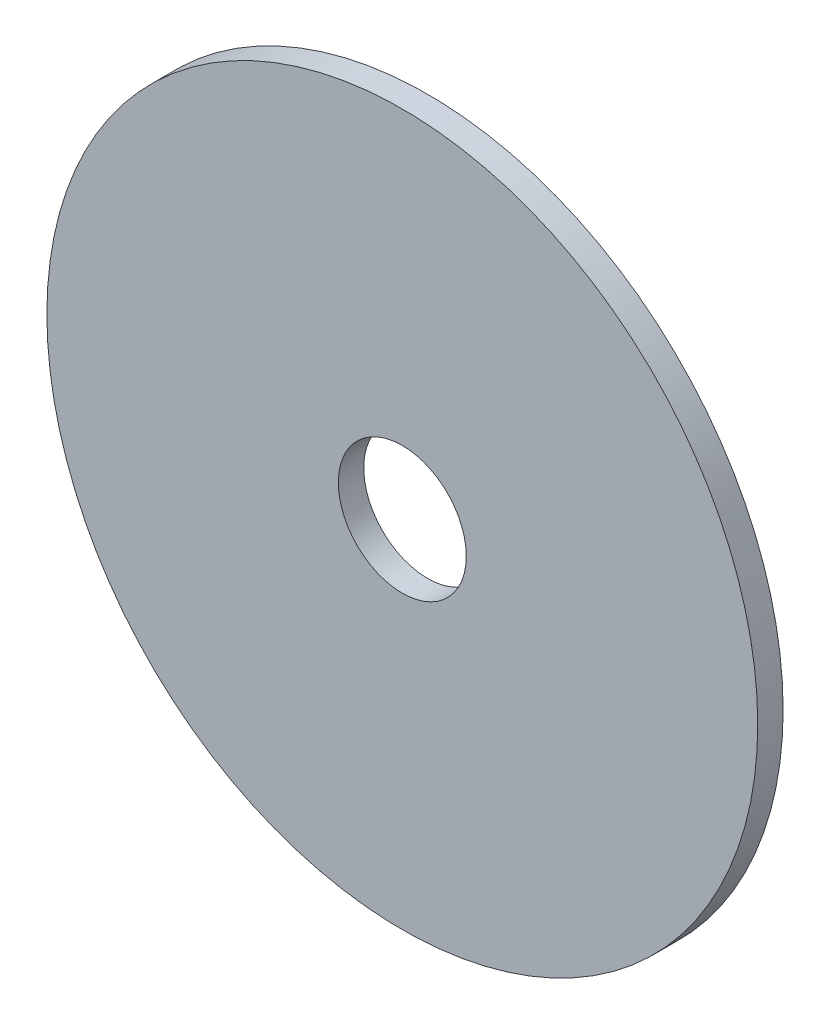
ISO-10303-21;
HEADER;
FILE_DESCRIPTION(('STEP AP214'),'2;1');
FILE_NAME('part.step','',(''),(''),'','','');
FILE_SCHEMA(('AUTOMOTIVE_DESIGN { 1 0 10303 214 1 1 1 1 }'));
ENDSEC;
DATA;
#1=APPLICATION_CONTEXT('core data for automotive mechanical design processes');
#2=APPLICATION_PROTOCOL_DEFINITION('international standard','automotive_design',2000,#1);
#3=PRODUCT_CONTEXT('',#1,'mechanical');
#4=PRODUCT('Part','Part','',(#3));
#5=PRODUCT_RELATED_PRODUCT_CATEGORY('part','',(#4));
#6=PRODUCT_DEFINITION_FORMATION('','',#4);
#7=PRODUCT_DEFINITION_CONTEXT('part definition',#1,'design');
#8=PRODUCT_DEFINITION('design','',#6,#7);
#9=PRODUCT_DEFINITION_SHAPE('','',#8);
#10=(LENGTH_UNIT() NAMED_UNIT(*) SI_UNIT(.MILLI.,.METRE.));
#11=(NAMED_UNIT(*) PLANE_ANGLE_UNIT() SI_UNIT($,.RADIAN.));
#12=(NAMED_UNIT(*) SI_UNIT($,.STERADIAN.) SOLID_ANGLE_UNIT());
#13=UNCERTAINTY_MEASURE_WITH_UNIT(LENGTH_MEASURE(1.E-05),#10,'distance_accuracy_value','');
#14=(GEOMETRIC_REPRESENTATION_CONTEXT(3) GLOBAL_UNCERTAINTY_ASSIGNED_CONTEXT((#13)) GLOBAL_UNIT_ASSIGNED_CONTEXT((#10,
#11,#12)) REPRESENTATION_CONTEXT('',''));
#15=CARTESIAN_POINT('',(0.,0.,0.));
#16=DIRECTION('',(0.,0.,1.));
#17=DIRECTION('',(1.,0.,0.));
#18=AXIS2_PLACEMENT_3D('',#15,#16,#17);
#19=CARTESIAN_POINT('',(0.,0.,1.5875));
#20=DIRECTION('',(0.,0.,1.));
#21=DIRECTION('',(1.,0.,0.));
#22=AXIS2_PLACEMENT_3D('',#19,#20,#21);
#23=PLANE('',#22);
#24=CARTESIAN_POINT('',(0.,0.,1.5875));
#25=DIRECTION('',(0.,0.,1.));
#26=DIRECTION('',(1.,0.,0.));
#27=AXIS2_PLACEMENT_3D('',#24,#25,#26);
#28=CIRCLE('',#27,22.225);
#29=CARTESIAN_POINT('',(22.225,0.,1.5875));
#30=VERTEX_POINT('',#29);
#31=EDGE_CURVE('E10',#30,#30,#28,.T.);
#32=ORIENTED_EDGE('',*,*,#31,.T.);
#33=EDGE_LOOP('',(#32));
#34=FACE_BOUND('',#33,.T.);
#35=CARTESIAN_POINT('',(0.,0.,1.5875));
#36=DIRECTION('',(0.,0.,1.));
#37=DIRECTION('',(1.,0.,0.));
#38=AXIS2_PLACEMENT_3D('',#35,#36,#37);
#39=CIRCLE('',#38,4.);
#40=CARTESIAN_POINT('',(4.,0.,1.5875));
#41=VERTEX_POINT('',#40);
#42=EDGE_CURVE('E56',#41,#41,#39,.T.);
#43=ORIENTED_EDGE('',*,*,#42,.F.);
#44=EDGE_LOOP('',(#43));
#45=FACE_BOUND('',#44,.T.);
#46=ADVANCED_FACE('F43',(#34,#45),#23,.T.);
#47=CARTESIAN_POINT('',(0.,0.,0.));
#48=DIRECTION('',(0.,0.,1.));
#49=DIRECTION('',(1.,0.,0.));
#50=AXIS2_PLACEMENT_3D('',#47,#48,#49);
#51=PLANE('',#50);
#52=CARTESIAN_POINT('',(0.,0.,0.));
#53=DIRECTION('',(0.,0.,1.));
#54=DIRECTION('',(1.,0.,0.));
#55=AXIS2_PLACEMENT_3D('',#52,#53,#54);
#56=CIRCLE('',#55,22.225);
#57=CARTESIAN_POINT('',(22.225,0.,0.));
#58=VERTEX_POINT('',#57);
#59=EDGE_CURVE('E47',#58,#58,#56,.T.);
#60=ORIENTED_EDGE('',*,*,#59,.F.);
#61=EDGE_LOOP('',(#60));
#62=FACE_BOUND('',#61,.T.);
#63=CARTESIAN_POINT('',(0.,0.,0.));
#64=DIRECTION('',(0.,0.,1.));
#65=DIRECTION('',(1.,0.,0.));
#66=AXIS2_PLACEMENT_3D('',#63,#64,#65);
#67=CIRCLE('',#66,4.);
#68=CARTESIAN_POINT('',(4.,0.,0.));
#69=VERTEX_POINT('',#68);
#70=EDGE_CURVE('E58',#69,#69,#67,.T.);
#71=ORIENTED_EDGE('',*,*,#70,.T.);
#72=EDGE_LOOP('',(#71));
#73=FACE_BOUND('',#72,.T.);
#74=ADVANCED_FACE('F70',(#62,#73),#51,.F.);
#75=CARTESIAN_POINT('',(0.,0.,1.5875));
#76=DIRECTION('',(0.,0.,-1.));
#77=DIRECTION('',(-1.,0.,0.));
#78=AXIS2_PLACEMENT_3D('',#75,#76,#77);
#79=CYLINDRICAL_SURFACE('',#78,22.225);
#80=ORIENTED_EDGE('',*,*,#31,.F.);
#81=EDGE_LOOP('',(#80));
#82=FACE_BOUND('',#81,.T.);
#83=ORIENTED_EDGE('',*,*,#59,.T.);
#84=EDGE_LOOP('',(#83));
#85=FACE_BOUND('',#84,.T.);
#86=ADVANCED_FACE('F45',(#82,#85),#79,.T.);
#87=CARTESIAN_POINT('',(0.,0.,1.5875));
#88=DIRECTION('',(0.,0.,-1.));
#89=DIRECTION('',(-1.,0.,0.));
#90=AXIS2_PLACEMENT_3D('',#87,#88,#89);
#91=CYLINDRICAL_SURFACE('',#90,4.);
#92=ORIENTED_EDGE('',*,*,#42,.T.);
#93=EDGE_LOOP('',(#92));
#94=FACE_BOUND('',#93,.T.);
#95=ORIENTED_EDGE('',*,*,#70,.F.);
#96=EDGE_LOOP('',(#95));
#97=FACE_BOUND('',#96,.T.);
#98=ADVANCED_FACE('F66',(#94,#97),#91,.F.);
#99=CLOSED_SHELL('',(#46,#74,#86,#98));
#100=MANIFOLD_SOLID_BREP('B2',#99);
#101=ADVANCED_BREP_SHAPE_REPRESENTATION('',(#18,#100),#14);
#102=SHAPE_DEFINITION_REPRESENTATION(#9,#101);
ENDSEC;
END-ISO-10303-21;
